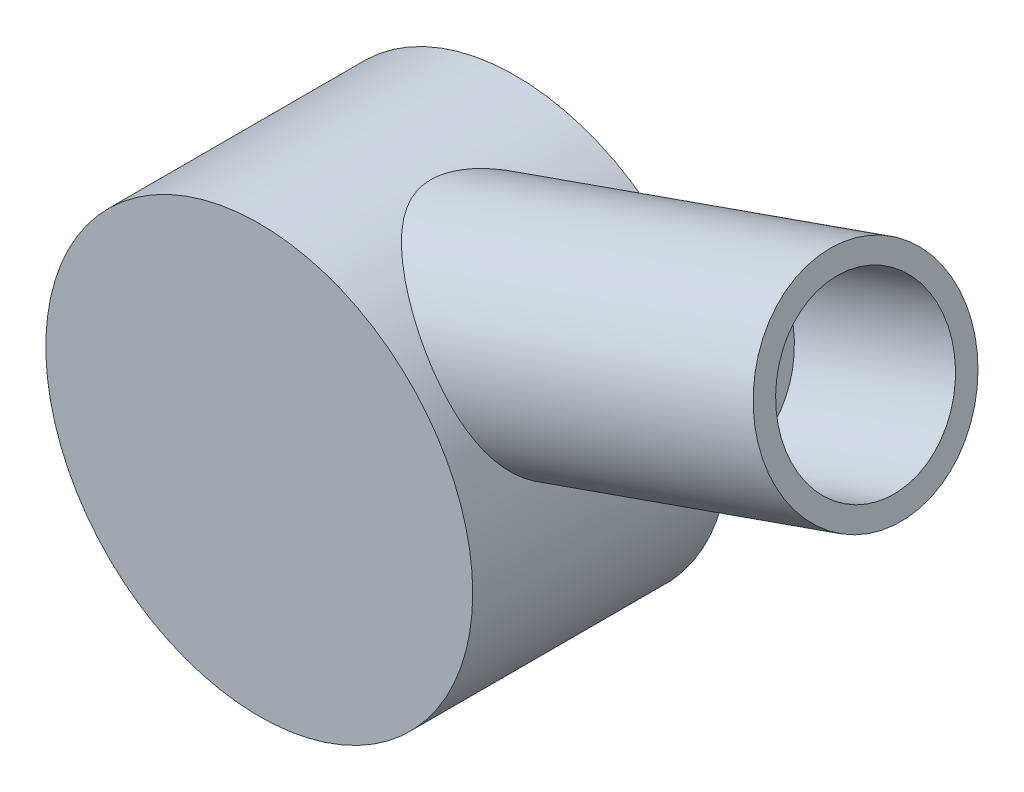
ISO-10303-21;
HEADER;
FILE_DESCRIPTION(('STEP AP214'),'2;1');
FILE_NAME('part.step','',(''),(''),'','','');
FILE_SCHEMA(('AUTOMOTIVE_DESIGN { 1 0 10303 214 1 1 1 1 }'));
ENDSEC;
DATA;
#1=APPLICATION_CONTEXT('core data for automotive mechanical design processes');
#2=APPLICATION_PROTOCOL_DEFINITION('international standard','automotive_design',2000,#1);
#3=PRODUCT_CONTEXT('',#1,'mechanical');
#4=PRODUCT('Part','Part','',(#3));
#5=PRODUCT_RELATED_PRODUCT_CATEGORY('part','',(#4));
#6=PRODUCT_DEFINITION_FORMATION('','',#4);
#7=PRODUCT_DEFINITION_CONTEXT('part definition',#1,'design');
#8=PRODUCT_DEFINITION('design','',#6,#7);
#9=PRODUCT_DEFINITION_SHAPE('','',#8);
#10=(LENGTH_UNIT() NAMED_UNIT(*) SI_UNIT(.MILLI.,.METRE.));
#11=(NAMED_UNIT(*) PLANE_ANGLE_UNIT() SI_UNIT($,.RADIAN.));
#12=(NAMED_UNIT(*) SI_UNIT($,.STERADIAN.) SOLID_ANGLE_UNIT());
#13=UNCERTAINTY_MEASURE_WITH_UNIT(LENGTH_MEASURE(1.E-05),#10,'distance_accuracy_value','');
#14=(GEOMETRIC_REPRESENTATION_CONTEXT(3) GLOBAL_UNCERTAINTY_ASSIGNED_CONTEXT((#13)) GLOBAL_UNIT_ASSIGNED_CONTEXT((#10,
#11,#12)) REPRESENTATION_CONTEXT('',''));
#15=CARTESIAN_POINT('',(0.,0.,0.));
#16=DIRECTION('',(0.,0.,1.));
#17=DIRECTION('',(1.,0.,0.));
#18=AXIS2_PLACEMENT_3D('',#15,#16,#17);
#19=CARTESIAN_POINT('',(0.,0.,-76.2));
#20=DIRECTION('',(0.,0.,1.));
#21=DIRECTION('',(-1.,0.,0.));
#22=AXIS2_PLACEMENT_3D('',#19,#20,#21);
#23=CYLINDRICAL_SURFACE('',#22,63.5);
#24=CARTESIAN_POINT('',(0.,0.,-76.2));
#25=DIRECTION('',(0.,0.,1.));
#26=DIRECTION('',(1.,0.,0.));
#27=AXIS2_PLACEMENT_3D('',#24,#25,#26);
#28=CIRCLE('',#27,63.5);
#29=CARTESIAN_POINT('',(63.5,0.,-76.2));
#30=VERTEX_POINT('',#29);
#31=EDGE_CURVE('E10',#30,#30,#28,.T.);
#32=ORIENTED_EDGE('',*,*,#31,.T.);
#33=EDGE_LOOP('',(#32));
#34=FACE_BOUND('',#33,.T.);
#35=CARTESIAN_POINT('',(0.,0.,0.));
#36=DIRECTION('',(0.,0.,1.));
#37=DIRECTION('',(1.,0.,0.));
#38=AXIS2_PLACEMENT_3D('',#35,#36,#37);
#39=CIRCLE('',#38,63.5);
#40=CARTESIAN_POINT('',(63.5,0.,0.));
#41=VERTEX_POINT('',#40);
#42=EDGE_CURVE('E39',#41,#41,#39,.T.);
#43=ORIENTED_EDGE('',*,*,#42,.F.);
#44=EDGE_LOOP('',(#43));
#45=FACE_BOUND('',#44,.T.);
#46=CARTESIAN_POINT('',(12.902137328997,62.1754360848696,-38.1));
#47=CARTESIAN_POINT('',(12.9021337095606,62.1754363442822,-38.6157617412608));
#48=CARTESIAN_POINT('',(12.9260503314376,62.170488105721,-39.1315051778435));
#49=CARTESIAN_POINT('',(13.0207396640451,62.150725244645,-40.1586485981103));
#50=CARTESIAN_POINT('',(13.0915305360627,62.1359067979347,-40.6700468204394));
#51=CARTESIAN_POINT('',(13.2773983061103,62.0964544912244,-41.6851813821708));
#52=CARTESIAN_POINT('',(13.3925525535344,62.0718034850787,-42.1889027330304));
#53=CARTESIAN_POINT('',(13.6632059908368,62.012788345497,-43.184918737362));
#54=CARTESIAN_POINT('',(13.8187186748822,61.9784209629684,-43.6772095088334));
#55=CARTESIAN_POINT('',(14.1082096824427,61.9130240876597,-44.4878138280625));
#56=CARTESIAN_POINT('',(14.2323511947056,61.8846375641336,-44.8099148416984));
#57=CARTESIAN_POINT('',(14.4952316370714,61.8235916877659,-45.4475639184351));
#58=CARTESIAN_POINT('',(14.6339663321866,61.7909335738871,-45.7631138510256));
#59=CARTESIAN_POINT('',(15.070210173798,61.6865302909287,-46.7000217436048));
#60=CARTESIAN_POINT('',(15.3876902133846,61.6083713985638,-47.3114490957551));
#61=CARTESIAN_POINT('',(16.0665821621365,61.4348273169205,-48.5084277819898));
#62=CARTESIAN_POINT('',(16.4280965910541,61.3394016670383,-49.0939142304577));
#63=CARTESIAN_POINT('',(17.1862254917113,61.1313187151844,-50.2383835613791));
#64=CARTESIAN_POINT('',(17.5828396161044,61.0186615837274,-50.7973667060253));
#65=CARTESIAN_POINT('',(18.3347646826826,60.7964890300245,-51.7972740432026));
#66=CARTESIAN_POINT('',(18.685671782535,60.6896814835651,-52.2421419006709));
#67=CARTESIAN_POINT('',(19.404034244645,60.4638339205311,-53.1151773436102));
#68=CARTESIAN_POINT('',(19.7714918091498,60.3447922733385,-53.5433426923736));
#69=CARTESIAN_POINT('',(20.5205068829208,60.0942165297526,-54.3837647406891));
#70=CARTESIAN_POINT('',(20.9020717591319,59.9626758483319,-54.7960128917355));
#71=CARTESIAN_POINT('',(21.6769375799192,59.686929097553,-55.6048923231537));
#72=CARTESIAN_POINT('',(22.0702380598715,59.5427235291719,-56.00152422035));
#73=CARTESIAN_POINT('',(22.8671927048791,59.2412287389317,-56.7800392699078));
#74=CARTESIAN_POINT('',(23.2708575829035,59.0839255687224,-57.1619060478471));
#75=CARTESIAN_POINT('',(24.0865759486968,58.7561079060064,-57.9107409542552));
#76=CARTESIAN_POINT('',(24.498630149041,58.5855922877756,-58.2777078091554));
#77=CARTESIAN_POINT('',(25.7450187947831,58.0539326805794,-59.3563102035028));
#78=CARTESIAN_POINT('',(26.5899272834499,57.6725456967092,-60.0459847152011));
#79=CARTESIAN_POINT('',(28.3437097808088,56.8320310839143,-61.4014576016182));
#80=CARTESIAN_POINT('',(29.2535981914788,56.3698509993324,-62.0640440880746));
#81=CARTESIAN_POINT('',(31.0851783440751,55.3809075943599,-63.321747855269));
#82=CARTESIAN_POINT('',(32.0068716017698,54.8541359042808,-63.9168563730373));
#83=CARTESIAN_POINT('',(33.8522169279567,53.7349080187182,-65.0343821148344));
#84=CARTESIAN_POINT('',(34.7758641339652,53.1425493930707,-65.5569047775255));
#85=CARTESIAN_POINT('',(36.6180853938601,51.8903215147721,-66.5241339349708));
#86=CARTESIAN_POINT('',(37.536660594481,51.2304682409817,-66.9688587805261));
#87=CARTESIAN_POINT('',(39.188185025054,49.9740005505901,-67.6970538471665));
#88=CARTESIAN_POINT('',(39.9234868788288,49.3889103275958,-67.9951185372808));
#89=CARTESIAN_POINT('',(41.3801446107149,48.1750149044565,-68.5302428366208));
#90=CARTESIAN_POINT('',(42.1015018327898,47.5462139442077,-68.7673083522444));
#91=CARTESIAN_POINT('',(43.5248522954722,46.2467894131457,-69.1752703763103));
#92=CARTESIAN_POINT('',(44.2268497517851,45.5761750528387,-69.3461813976591));
#93=CARTESIAN_POINT('',(45.6060751592512,44.1960121875524,-69.6166277097731));
#94=CARTESIAN_POINT('',(46.2833028343019,43.4864632487997,-69.7161622051525));
#95=CARTESIAN_POINT('',(47.6128001390751,42.0268217484646,-69.8392591187137));
#96=CARTESIAN_POINT('',(48.2648120569548,41.2764384664543,-69.8621757520205));
#97=CARTESIAN_POINT('',(49.5319801304282,39.7469374065163,-69.8255856686528));
#98=CARTESIAN_POINT('',(50.1471357853918,38.9678192385058,-69.7660778326459));
#99=CARTESIAN_POINT('',(51.334761820945,37.3893969149955,-69.5611219160725));
#100=CARTESIAN_POINT('',(51.9072617241102,36.5901072431259,-69.4157339082947));
#101=CARTESIAN_POINT('',(53.0054253138171,34.9803342715598,-69.0369251055834));
#102=CARTESIAN_POINT('',(53.5310961297305,34.1698526975199,-68.8035177393384));
#103=CARTESIAN_POINT('',(54.4643285402613,32.6583205364264,-68.2860013933387));
#104=CARTESIAN_POINT('',(54.8782391544245,31.957337749618,-68.0130634548489));
#105=CARTESIAN_POINT('',(55.667327555343,30.5620806806335,-67.4019915353025));
#106=CARTESIAN_POINT('',(56.0425092844274,29.8678057221817,-67.0638642001378));
#107=CARTESIAN_POINT('',(56.7537080064813,28.4932546248597,-66.3241944780053));
#108=CARTESIAN_POINT('',(57.089728758172,27.8129771476628,-65.9226581858377));
#109=CARTESIAN_POINT('',(57.7231099524352,26.4734121892255,-65.0587114758677));
#110=CARTESIAN_POINT('',(58.0204701191647,25.8141248577749,-64.5963006237731));
#111=CARTESIAN_POINT('',(58.5660317245826,24.5504305777326,-63.6345151460397));
#112=CARTESIAN_POINT('',(58.8157736491568,23.9448816435581,-63.1375098288369));
#113=CARTESIAN_POINT('',(59.2825275649846,22.764766720936,-62.0939064039348));
#114=CARTESIAN_POINT('',(59.4995409003174,22.1901994607735,-61.5473103342775));
#115=CARTESIAN_POINT('',(59.9029130451492,21.0770397835974,-60.4080059998109));
#116=CARTESIAN_POINT('',(60.08926807493,20.5384518071546,-59.8152920625947));
#117=CARTESIAN_POINT('',(60.4336194264656,19.5019476456273,-58.5875645705557));
#118=CARTESIAN_POINT('',(60.5916145096021,19.0040332374747,-57.95254916988));
#119=CARTESIAN_POINT('',(60.8887360451615,18.0300728861087,-56.6124520946245));
#120=CARTESIAN_POINT('',(61.0265785041396,17.5562530811086,-55.9054666135619));
#121=CARTESIAN_POINT('',(61.2766789582453,16.6623560973176,-54.4539896356698));
#122=CARTESIAN_POINT('',(61.3889362973904,16.2422802966019,-53.7094971777881));
#123=CARTESIAN_POINT('',(61.5906679544625,15.4597218182046,-52.18771612303));
#124=CARTESIAN_POINT('',(61.6801385766728,15.0972484864937,-51.4104222299767));
#125=CARTESIAN_POINT('',(61.8388479736055,14.4334128945141,-49.8281600666867));
#126=CARTESIAN_POINT('',(61.9080864574952,14.1320515127357,-49.0231913988169));
#127=CARTESIAN_POINT('',(62.0307691384326,13.5836512902181,-47.3613057080125));
#128=CARTESIAN_POINT('',(62.0835532847916,13.3389649301933,-46.5035622874569));
#129=CARTESIAN_POINT('',(62.1718900863073,12.9209816174306,-44.7699626713395));
#130=CARTESIAN_POINT('',(62.2074423177161,12.7476864202792,-43.89410603091));
#131=CARTESIAN_POINT('',(62.2628174802219,12.4744155109026,-42.1305938564993));
#132=CARTESIAN_POINT('',(62.2826415457825,12.3744345106063,-41.2429391782005));
#133=CARTESIAN_POINT('',(62.3074515444767,12.2489020584188,-39.4621833610183));
#134=CARTESIAN_POINT('',(62.3124376721854,12.22334963052,-38.5690822937091));
#135=CARTESIAN_POINT('',(62.3078158291739,12.2468857079611,-36.7896397982963));
#136=CARTESIAN_POINT('',(62.298301290172,12.2954963626146,-35.9032917653032));
#137=CARTESIAN_POINT('',(62.2644205541392,12.4659318427072,-34.1379534066362));
#138=CARTESIAN_POINT('',(62.2400543736903,12.5877565864027,-33.2589630727487));
#139=CARTESIAN_POINT('',(62.1754064154817,12.903283341574,-31.5145073966868));
#140=CARTESIAN_POINT('',(62.1351233450334,13.0969911909514,-30.6490431589693));
#141=CARTESIAN_POINT('',(62.0369941200259,13.5541859737333,-28.9377676798547));
#142=CARTESIAN_POINT('',(61.9791478776198,13.8176732561578,-28.0919565367809));
#143=CARTESIAN_POINT('',(61.84370775265,14.4117515258623,-26.4255548726267));
#144=CARTESIAN_POINT('',(61.7661073457101,14.7423646760578,-25.6049727847126));
#145=CARTESIAN_POINT('',(61.5885787684526,15.467259844746,-23.9949350424799));
#146=CARTESIAN_POINT('',(61.4886505563195,15.8615419824775,-23.2054794464583));
#147=CARTESIAN_POINT('',(61.2635447701406,16.7098955435813,-21.6629957870044));
#148=CARTESIAN_POINT('',(61.1383639304618,17.1639746971767,-20.90997245057));
#149=CARTESIAN_POINT('',(60.859659241011,18.1274172031386,-19.4456753222611));
#150=CARTESIAN_POINT('',(60.7061353246141,18.6367806854586,-18.734401628531));
#151=CARTESIAN_POINT('',(60.366528015177,19.7091474270019,-17.3543270108197));
#152=CARTESIAN_POINT('',(60.1802464497501,20.2724670755231,-16.6858204538934));
#153=CARTESIAN_POINT('',(59.7726882923867,21.4443574291969,-15.4011333727858));
#154=CARTESIAN_POINT('',(59.5514114346828,22.052928477987,-14.7849532460458));
#155=CARTESIAN_POINT('',(59.0711443634514,23.3088313649395,-13.6098212433693));
#156=CARTESIAN_POINT('',(58.8121664725132,23.9561504977341,-13.0508507697251));
#157=CARTESIAN_POINT('',(58.2541558710975,25.2828195664852,-11.9942706235398));
#158=CARTESIAN_POINT('',(57.9551250379578,25.9621680002168,-11.4966580771646));
#159=CARTESIAN_POINT('',(57.3279666320877,27.3183131331617,-10.5848272487142));
#160=CARTESIAN_POINT('',(57.0014385710957,27.9941665092055,-10.1681050555402));
#161=CARTESIAN_POINT('',(56.3092976485612,29.3615398972055,-9.39756017825054));
#162=CARTESIAN_POINT('',(55.9436859103514,30.0530594584383,-9.04373568712387));
#163=CARTESIAN_POINT('',(55.1736986285343,31.4443132768166,-8.40105296127234));
#164=CARTESIAN_POINT('',(54.7693356441749,32.1440448083821,-8.1121737787054));
#165=CARTESIAN_POINT('',(53.9228263686847,33.5447207226021,-7.6002843223896));
#166=CARTESIAN_POINT('',(53.4806809739009,34.2456650760974,-7.37727248656791));
#167=CARTESIAN_POINT('',(52.5808456418615,35.6110018900721,-7.00554969436024));
#168=CARTESIAN_POINT('',(52.1247017823935,36.2756427727634,-6.85399510915528));
#169=CARTESIAN_POINT('',(51.1819618900744,37.5940617133573,-6.61030695907891));
#170=CARTESIAN_POINT('',(50.6953669742677,38.247840168617,-6.51817121593032));
#171=CARTESIAN_POINT('',(49.6944139208079,39.5396388486974,-6.39176501680004));
#172=CARTESIAN_POINT('',(49.1800517106884,40.1776567418983,-6.35750307275369));
#173=CARTESIAN_POINT('',(48.1267119213087,41.4335787068809,-6.34470522160856));
#174=CARTESIAN_POINT('',(47.587733330539,42.0514819503433,-6.3661716064649));
#175=CARTESIAN_POINT('',(46.4631409356796,43.2915579779291,-6.46442817959286));
#176=CARTESIAN_POINT('',(45.8765223964276,43.9126195716363,-6.54371794752755));
#177=CARTESIAN_POINT('',(44.6837353812716,45.1257974810285,-6.7570785189217));
#178=CARTESIAN_POINT('',(44.0775664530814,45.7179131262684,-6.89115059057469));
#179=CARTESIAN_POINT('',(42.8493162731048,46.8710552205729,-7.21062235678597));
#180=CARTESIAN_POINT('',(42.2272328880609,47.4320774694609,-7.396028965563));
#181=CARTESIAN_POINT('',(40.9707898742719,48.5214998919797,-7.81472040420745));
#182=CARTESIAN_POINT('',(40.3364295932225,49.0498983259348,-8.0480077844692));
#183=CARTESIAN_POINT('',(38.9586184919815,50.1534875367389,-8.59927983268282));
#184=CARTESIAN_POINT('',(38.2136563874218,50.7230272280152,-8.92480906455594));
#185=CARTESIAN_POINT('',(36.7167299584393,51.8169025657614,-9.63096160809086));
#186=CARTESIAN_POINT('',(35.9647649719728,52.3412338892195,-10.0115901792777));
#187=CARTESIAN_POINT('',(34.4575837830218,53.3455334800837,-10.8244598656607));
#188=CARTESIAN_POINT('',(33.7023647245646,53.825446562411,-11.2567636944507));
#189=CARTESIAN_POINT('',(32.1941167903291,54.7409097546647,-12.1693622581511));
#190=CARTESIAN_POINT('',(31.4410879646537,55.1764588573717,-12.6496580821594));
#191=CARTESIAN_POINT('',(29.780445119459,56.0932931009579,-13.7640303272025));
#192=CARTESIAN_POINT('',(28.8744114252727,56.5642720559765,-14.4089655998336));
#193=CARTESIAN_POINT('',(27.0805395348716,57.4446901482601,-15.7636970583978));
#194=CARTESIAN_POINT('',(26.192706951607,57.8541105411937,-16.4735128948351));
#195=CARTESIAN_POINT('',(24.8830463980571,58.423546816103,-17.5859128174675));
#196=CARTESIAN_POINT('',(24.4503144560604,58.6058566681457,-17.9645250413302));
#197=CARTESIAN_POINT('',(23.593563774006,58.9559813773901,-18.7379382567931));
#198=CARTESIAN_POINT('',(23.1695442482291,59.123797546099,-19.1327377788561));
#199=CARTESIAN_POINT('',(22.3321348452795,59.4451579174039,-19.9386267782765));
#200=CARTESIAN_POINT('',(21.9187397240731,59.5987092626997,-20.3497079543733));
#201=CARTESIAN_POINT('',(21.104333132385,59.8919397521534,-21.1888498101167));
#202=CARTESIAN_POINT('',(20.703323018915,60.0316173798728,-21.6169123387355));
#203=CARTESIAN_POINT('',(19.8645373027356,60.3147645699787,-22.547831130873));
#204=CARTESIAN_POINT('',(19.4288290543089,60.4563329560905,-23.0531383538241));
#205=CARTESIAN_POINT('',(18.5807018551651,60.7223597258825,-24.0871336402127));
#206=CARTESIAN_POINT('',(18.1682776751971,60.8468219604259,-24.6158164059131));
#207=CARTESIAN_POINT('',(17.3719805870592,61.0789343122851,-25.6977210222538));
#208=CARTESIAN_POINT('',(16.9881013702936,61.1865881501684,-26.2509374074237));
#209=CARTESIAN_POINT('',(16.2554090349014,61.3853051044494,-27.3830500795024));
#210=CARTESIAN_POINT('',(15.9065903099274,61.4763708752593,-27.9619422393216));
#211=CARTESIAN_POINT('',(15.3074806457867,61.6279953536334,-29.0458229071175));
#212=CARTESIAN_POINT('',(15.0505041669195,61.6911087803616,-29.5467482977767));
#213=CARTESIAN_POINT('',(14.571760391279,61.8059415588371,-30.5665929739091));
#214=CARTESIAN_POINT('',(14.349995358584,61.8576601779868,-31.0855134138433));
#215=CARTESIAN_POINT('',(13.9482471272141,61.9494861103712,-32.1387755448691));
#216=CARTESIAN_POINT('',(13.7681513062946,61.9896247958335,-32.673071173695));
#217=CARTESIAN_POINT('',(13.4551077570075,62.0583262802368,-33.7558398840141));
#218=CARTESIAN_POINT('',(13.3221326537315,62.0868958016969,-34.3043045346002));
#219=CARTESIAN_POINT('',(13.1124789112607,62.1315059037689,-35.3915801749085));
#220=CARTESIAN_POINT('',(13.0339137638821,62.1479677113248,-35.9300070409351));
#221=CARTESIAN_POINT('',(12.9287407538437,62.1699335355224,-37.0122954889394));
#222=CARTESIAN_POINT('',(12.9021411454915,62.1754358113334,-37.5561579205252));
#223=CARTESIAN_POINT('',(12.902137328997,62.1754360848696,-38.1));
#224=B_SPLINE_CURVE_WITH_KNOTS('',3,(#46,#47,#48,#49,#50,#51,#52,#53,#54,#55,#56,#57,#58,#59,
#60,#61,#62,#63,#64,#65,#66,#67,#68,#69,#70,#71,#72,#73,#74,#75,#76,#77,#78,#79,#80,#81,#82,#83,
#84,#85,#86,#87,#88,#89,#90,#91,#92,#93,#94,#95,#96,#97,#98,#99,#100,#101,#102,#103,#104,#105,
#106,#107,#108,#109,#110,#111,#112,#113,#114,#115,#116,#117,#118,#119,#120,#121,#122,#123,#124,
#125,#126,#127,#128,#129,#130,#131,#132,#133,#134,#135,#136,#137,#138,#139,#140,#141,#142,#143,
#144,#145,#146,#147,#148,#149,#150,#151,#152,#153,#154,#155,#156,#157,#158,#159,#160,#161,#162,
#163,#164,#165,#166,#167,#168,#169,#170,#171,#172,#173,#174,#175,#176,#177,#178,#179,#180,#181,
#182,#183,#184,#185,#186,#187,#188,#189,#190,#191,#192,#193,#194,#195,#196,#197,#198,#199,#200,
#201,#202,#203,#204,#205,#206,#207,#208,#209,#210,#211,#212,#213,#214,#215,#216,#217,#218,#219,
#220,#221,#222,#223),.UNSPECIFIED.,.T.,.F.,(4,2,2,2,2,2,2,2,2,2,2,2,2,2,2,2,2,2,2,2,2,2,2,2,2,2,
2,2,2,2,2,2,2,2,2,2,2,2,2,2,2,2,2,2,2,2,2,2,2,2,2,2,2,2,2,2,2,2,2,2,2,2,2,2,2,2,2,2,2,2,2,2,2,2,
2,2,2,2,2,2,2,2,2,2,2,2,2,2,4),(0.,1.54669041487142,3.09398044120839,4.64398053156463,
6.19449954609793,7.2331978337115,8.27159551510625,10.348992916513,12.431322782684,
14.5136320444196,16.2427684798922,17.9721356823625,19.70241909538,21.432634095437,
23.1647158590362,24.8969453617027,28.3599028553547,32.0067238598152,35.6540179145242,
39.295957211186,42.9370362923878,45.89179852698,48.8462745515574,51.8001020583085,
54.7539624805852,57.7326580144909,60.7113939997686,63.6880488360776,66.6642497221445,
69.2367692455674,71.8090266457686,74.3810369536967,76.9530656118926,79.4170304858186,
81.8808941434662,84.3450613320085,86.8093361166703,89.3929278728318,91.9765858628142,
94.5606626229123,97.1447765267337,99.8221327782777,102.499554865002,105.176783813262,
107.85397765393,110.513994391018,113.174008158197,115.83423800255,118.494481152986,
121.155604067133,123.816731965075,126.478204217053,129.139682725324,131.817853911311,
134.496045437314,137.1733635532,139.850556223304,142.422832658977,144.995035182833,
147.566406859233,150.137717549535,152.595601634575,155.053395609188,157.511551038601,
159.969807566885,162.541148852469,165.112549667188,167.684296990999,170.256181335844,
173.231267802485,176.206638444449,179.185657403268,182.164743981293,185.784464154005,
189.405284294311,191.214491873176,193.023535568203,194.831668498448,196.639998846007,
198.685270735102,200.730081444612,202.774438888088,204.818468906805,206.516737532768,
208.215115312367,209.908847702996,211.601594495769,213.232234548276,214.863133593776),.UNSPECIFIED.);
#225=CARTESIAN_POINT('',(12.902137328997,62.1754360848696,-38.1));
#226=VERTEX_POINT('',#225);
#227=EDGE_CURVE('E51',#226,#226,#224,.T.);
#228=ORIENTED_EDGE('',*,*,#227,.T.);
#229=EDGE_LOOP('',(#228));
#230=FACE_BOUND('',#229,.T.);
#231=ADVANCED_FACE('F35',(#34,#45,#230),#23,.T.);
#232=CARTESIAN_POINT('',(0.,0.,-76.2));
#233=DIRECTION('',(0.,0.,-1.));
#234=DIRECTION('',(1.,0.,0.));
#235=AXIS2_PLACEMENT_3D('',#232,#233,#234);
#236=PLANE('',#235);
#237=ORIENTED_EDGE('',*,*,#31,.F.);
#238=EDGE_LOOP('',(#237));
#239=FACE_BOUND('',#238,.T.);
#240=CARTESIAN_POINT('',(0.,0.,-76.2));
#241=DIRECTION('',(0.,0.,1.));
#242=DIRECTION('',(1.,0.,0.));
#243=AXIS2_PLACEMENT_3D('',#240,#241,#242);
#244=CIRCLE('',#243,25.4);
#245=CARTESIAN_POINT('',(25.4,0.,-76.2));
#246=VERTEX_POINT('',#245);
#247=EDGE_CURVE('E48',#246,#246,#244,.T.);
#248=ORIENTED_EDGE('',*,*,#247,.T.);
#249=EDGE_LOOP('',(#248));
#250=FACE_BOUND('',#249,.T.);
#251=ADVANCED_FACE('F83',(#239,#250),#236,.T.);
#252=CARTESIAN_POINT('',(0.,0.,0.));
#253=DIRECTION('',(0.,0.,-1.));
#254=DIRECTION('',(1.,0.,0.));
#255=AXIS2_PLACEMENT_3D('',#252,#253,#254);
#256=PLANE('',#255);
#257=ORIENTED_EDGE('',*,*,#42,.T.);
#258=EDGE_LOOP('',(#257));
#259=FACE_BOUND('',#258,.T.);
#260=ADVANCED_FACE('F81',(#259),#256,.F.);
#261=CARTESIAN_POINT('',(0.,0.,-38.1));
#262=DIRECTION('',(0.,0.,-1.));
#263=DIRECTION('',(1.,0.,0.));
#264=AXIS2_PLACEMENT_3D('',#261,#262,#263);
#265=CYLINDRICAL_SURFACE('',#264,25.4);
#266=CARTESIAN_POINT('',(0.,0.,-38.1));
#267=DIRECTION('',(0.,0.,1.));
#268=DIRECTION('',(1.,0.,0.));
#269=AXIS2_PLACEMENT_3D('',#266,#267,#268);
#270=CIRCLE('',#269,25.4);
#271=CARTESIAN_POINT('',(25.4,0.,-38.1));
#272=VERTEX_POINT('',#271);
#273=EDGE_CURVE('E46',#272,#272,#270,.T.);
#274=CARTESIAN_POINT('',(25.4,0.,-38.1));
#275=CARTESIAN_POINT('',(25.4,0.,-38.496875));
#276=CARTESIAN_POINT('',(25.4,0.,-38.89375));
#277=CARTESIAN_POINT('',(25.4,0.,-39.6875));
#278=CARTESIAN_POINT('',(25.4,0.,-40.084375));
#279=CARTESIAN_POINT('',(25.4,0.,-40.878125));
#280=CARTESIAN_POINT('',(25.4,0.,-41.275));
#281=CARTESIAN_POINT('',(25.4,0.,-42.06875));
#282=CARTESIAN_POINT('',(25.4,0.,-42.465625));
#283=CARTESIAN_POINT('',(25.4,0.,-43.259375));
#284=CARTESIAN_POINT('',(25.4,0.,-43.65625));
#285=CARTESIAN_POINT('',(25.4,0.,-44.45));
#286=CARTESIAN_POINT('',(25.4,0.,-44.846875));
#287=CARTESIAN_POINT('',(25.4,0.,-45.640625));
#288=CARTESIAN_POINT('',(25.4,0.,-46.0375));
#289=CARTESIAN_POINT('',(25.4,0.,-46.83125));
#290=CARTESIAN_POINT('',(25.4,0.,-47.228125));
#291=CARTESIAN_POINT('',(25.4,0.,-48.021875));
#292=CARTESIAN_POINT('',(25.4,0.,-48.41875));
#293=CARTESIAN_POINT('',(25.4,0.,-49.2125));
#294=CARTESIAN_POINT('',(25.4,0.,-49.609375));
#295=CARTESIAN_POINT('',(25.4,0.,-50.403125));
#296=CARTESIAN_POINT('',(25.4,0.,-50.8));
#297=CARTESIAN_POINT('',(25.4,0.,-51.59375));
#298=CARTESIAN_POINT('',(25.4,0.,-51.990625));
#299=CARTESIAN_POINT('',(25.4,0.,-52.784375));
#300=CARTESIAN_POINT('',(25.4,0.,-53.18125));
#301=CARTESIAN_POINT('',(25.4,0.,-53.975));
#302=CARTESIAN_POINT('',(25.4,0.,-54.371875));
#303=CARTESIAN_POINT('',(25.4,0.,-55.165625));
#304=CARTESIAN_POINT('',(25.4,0.,-55.5625));
#305=CARTESIAN_POINT('',(25.4,0.,-56.35625));
#306=CARTESIAN_POINT('',(25.4,0.,-56.753125));
#307=CARTESIAN_POINT('',(25.4,0.,-57.546875));
#308=CARTESIAN_POINT('',(25.4,0.,-57.94375));
#309=CARTESIAN_POINT('',(25.4,0.,-58.7375));
#310=CARTESIAN_POINT('',(25.4,0.,-59.134375));
#311=CARTESIAN_POINT('',(25.4,0.,-59.928125));
#312=CARTESIAN_POINT('',(25.4,0.,-60.325));
#313=CARTESIAN_POINT('',(25.4,0.,-61.11875));
#314=CARTESIAN_POINT('',(25.4,0.,-61.515625));
#315=CARTESIAN_POINT('',(25.4,0.,-62.309375));
#316=CARTESIAN_POINT('',(25.4,0.,-62.70625));
#317=CARTESIAN_POINT('',(25.4,0.,-63.5));
#318=CARTESIAN_POINT('',(25.4,0.,-63.896875));
#319=CARTESIAN_POINT('',(25.4,0.,-64.690625));
#320=CARTESIAN_POINT('',(25.4,0.,-65.0875));
#321=CARTESIAN_POINT('',(25.4,0.,-65.88125));
#322=CARTESIAN_POINT('',(25.4,0.,-66.278125));
#323=CARTESIAN_POINT('',(25.4,0.,-67.071875));
#324=CARTESIAN_POINT('',(25.4,0.,-67.46875));
#325=CARTESIAN_POINT('',(25.4,0.,-68.2625));
#326=CARTESIAN_POINT('',(25.4,0.,-68.659375));
#327=CARTESIAN_POINT('',(25.4,0.,-69.453125));
#328=CARTESIAN_POINT('',(25.4,0.,-69.85));
#329=CARTESIAN_POINT('',(25.4,0.,-70.64375));
#330=CARTESIAN_POINT('',(25.4,0.,-71.040625));
#331=CARTESIAN_POINT('',(25.4,0.,-71.834375));
#332=CARTESIAN_POINT('',(25.4,0.,-72.23125));
#333=CARTESIAN_POINT('',(25.4,0.,-73.025));
#334=CARTESIAN_POINT('',(25.4,0.,-73.421875));
#335=CARTESIAN_POINT('',(25.4,0.,-74.215625));
#336=CARTESIAN_POINT('',(25.4,0.,-74.6125));
#337=CARTESIAN_POINT('',(25.4,0.,-75.40625));
#338=CARTESIAN_POINT('',(25.4,0.,-75.803125));
#339=CARTESIAN_POINT('',(25.4,0.,-76.2));
#340=B_SPLINE_CURVE_WITH_KNOTS('',3,(#274,#275,#276,#277,#278,#279,#280,#281,#282,#283,#284,
#285,#286,#287,#288,#289,#290,#291,#292,#293,#294,#295,#296,#297,#298,#299,#300,#301,#302,#303,
#304,#305,#306,#307,#308,#309,#310,#311,#312,#313,#314,#315,#316,#317,#318,#319,#320,#321,#322,
#323,#324,#325,#326,#327,#328,#329,#330,#331,#332,#333,#334,#335,#336,#337,#338,#339),
.UNSPECIFIED.,.F.,.F.,(4,2,2,2,2,2,2,2,2,2,2,2,2,2,2,2,2,2,2,2,2,2,2,2,2,2,2,2,2,2,2,2,4),(0.,
1.19062499999999,2.38124999999999,3.571875,4.7625,5.953125,7.14375,8.33437499999999,
9.52499999999999,10.715625,11.90625,13.096875,14.2875,15.478125,16.66875,17.859375,19.05,
20.240625,21.43125,22.621875,23.8125,25.003125,26.19375,27.384375,28.575,29.765625,30.95625,
32.146875,33.3375,34.528125,35.71875,36.909375,38.1),.UNSPECIFIED.);
#341=EDGE_CURVE('BSEAM77',#272,#246,#340,.T.);
#342=ORIENTED_EDGE('',*,*,#273,.T.);
#343=ORIENTED_EDGE('',*,*,#247,.F.);
#344=ORIENTED_EDGE('',*,*,#341,.T.);
#345=ORIENTED_EDGE('',*,*,#341,.F.);
#346=EDGE_LOOP('',(#342,#344,#343,#345));
#347=FACE_BOUND('',#346,.T.);
#348=ADVANCED_FACE('F77',(#347),#265,.F.);
#349=CARTESIAN_POINT('',(0.,0.,-38.1));
#350=DIRECTION('',(0.,0.,-1.));
#351=DIRECTION('',(1.,0.,0.));
#352=AXIS2_PLACEMENT_3D('',#349,#350,#351);
#353=PLANE('',#352);
#354=ORIENTED_EDGE('',*,*,#273,.F.);
#355=EDGE_LOOP('',(#354));
#356=FACE_BOUND('',#355,.T.);
#357=ADVANCED_FACE('F68',(#356),#353,.T.);
#358=CARTESIAN_POINT('',(-83.8871052551613,-5.49417183119998,-38.1));
#359=DIRECTION('',(0.943433036589032,0.331563124415846,0.));
#360=DIRECTION('',(-0.331563124415846,0.943433036589032,0.));
#361=AXIS2_PLACEMENT_3D('',#358,#359,#360);
#362=CYLINDRICAL_SURFACE('',#361,31.75);
#363=CARTESIAN_POINT('',(142.259695525245,73.983583277414,-38.1));
#364=DIRECTION('',(-0.943433036589032,-0.331563124415846,0.));
#365=DIRECTION('',(-0.331563124415846,0.943433036589032,0.));
#366=AXIS2_PLACEMENT_3D('',#363,#364,#365);
#367=CIRCLE('',#366,31.75);
#368=CARTESIAN_POINT('',(131.732566325042,103.937582189116,-38.1));
#369=VERTEX_POINT('',#368);
#370=EDGE_CURVE('E60',#369,#369,#367,.T.);
#371=ORIENTED_EDGE('',*,*,#370,.T.);
#372=EDGE_LOOP('',(#371));
#373=FACE_BOUND('',#372,.T.);
#374=ORIENTED_EDGE('',*,*,#227,.F.);
#375=EDGE_LOOP('',(#374));
#376=FACE_BOUND('',#375,.T.);
#377=ADVANCED_FACE('F62',(#373,#376),#362,.T.);
#378=CARTESIAN_POINT('',(129.649672121891,109.864270226076,0.));
#379=DIRECTION('',(0.943433036589032,0.331563124415846,0.));
#380=DIRECTION('',(-0.331563124415846,0.943433036589033,0.));
#381=AXIS2_PLACEMENT_3D('',#378,#379,#380);
#382=PLANE('',#381);
#383=CARTESIAN_POINT('',(142.259695525245,73.983583277414,-38.1));
#384=DIRECTION('',(-0.943433036589032,-0.331563124415846,0.));
#385=DIRECTION('',(-0.331563124415846,0.943433036589032,0.));
#386=AXIS2_PLACEMENT_3D('',#383,#384,#385);
#387=CIRCLE('',#386,25.4);
#388=CARTESIAN_POINT('',(133.837992165082,97.9467824067754,-38.1));
#389=VERTEX_POINT('',#388);
#390=EDGE_CURVE('E156',#389,#389,#387,.T.);
#391=ORIENTED_EDGE('',*,*,#390,.T.);
#392=EDGE_LOOP('',(#391));
#393=FACE_BOUND('',#392,.T.);
#394=ORIENTED_EDGE('',*,*,#370,.F.);
#395=EDGE_LOOP('',(#394));
#396=FACE_BOUND('',#395,.T.);
#397=ADVANCED_FACE('F67',(#393,#396),#382,.T.);
#398=CARTESIAN_POINT('',(94.3332972665218,57.140176557089,-38.1));
#399=DIRECTION('',(0.943433036589032,0.331563124415846,0.));
#400=DIRECTION('',(-0.331563124415846,0.943433036589032,0.));
#401=AXIS2_PLACEMENT_3D('',#398,#399,#400);
#402=CYLINDRICAL_SURFACE('',#401,25.4);
#403=CARTESIAN_POINT('',(94.3332972665218,57.140176557089,-38.1));
#404=DIRECTION('',(-0.943433036589032,-0.331563124415846,0.));
#405=DIRECTION('',(-0.331563124415846,0.943433036589032,0.));
#406=AXIS2_PLACEMENT_3D('',#403,#404,#405);
#407=CIRCLE('',#406,25.4);
#408=CARTESIAN_POINT('',(85.9115939063593,81.1033756864505,-38.1));
#409=VERTEX_POINT('',#408);
#410=EDGE_CURVE('E155',#409,#409,#407,.T.);
#411=ORIENTED_EDGE('',*,*,#410,.T.);
#412=EDGE_LOOP('',(#411));
#413=FACE_BOUND('',#412,.T.);
#414=ORIENTED_EDGE('',*,*,#390,.F.);
#415=EDGE_LOOP('',(#414));
#416=FACE_BOUND('',#415,.T.);
#417=ADVANCED_FACE('F70',(#413,#416),#402,.F.);
#418=CARTESIAN_POINT('',(94.3332972665218,57.140176557089,-38.1));
#419=DIRECTION('',(0.943433036589032,0.331563124415846,0.));
#420=DIRECTION('',(-0.331563124415846,0.943433036589032,0.));
#421=AXIS2_PLACEMENT_3D('',#418,#419,#420);
#422=PLANE('',#421);
#423=ORIENTED_EDGE('',*,*,#410,.F.);
#424=EDGE_LOOP('',(#423));
#425=FACE_BOUND('',#424,.T.);
#426=ADVANCED_FACE('F141',(#425),#422,.T.);
#427=CLOSED_SHELL('',(#231,#251,#260,#348,#357,#377,#397,#417,#426));
#428=MANIFOLD_SOLID_BREP('B2',#427);
#429=ADVANCED_BREP_SHAPE_REPRESENTATION('',(#18,#428),#14);
#430=SHAPE_DEFINITION_REPRESENTATION(#9,#429);
ENDSEC;
END-ISO-10303-21;
